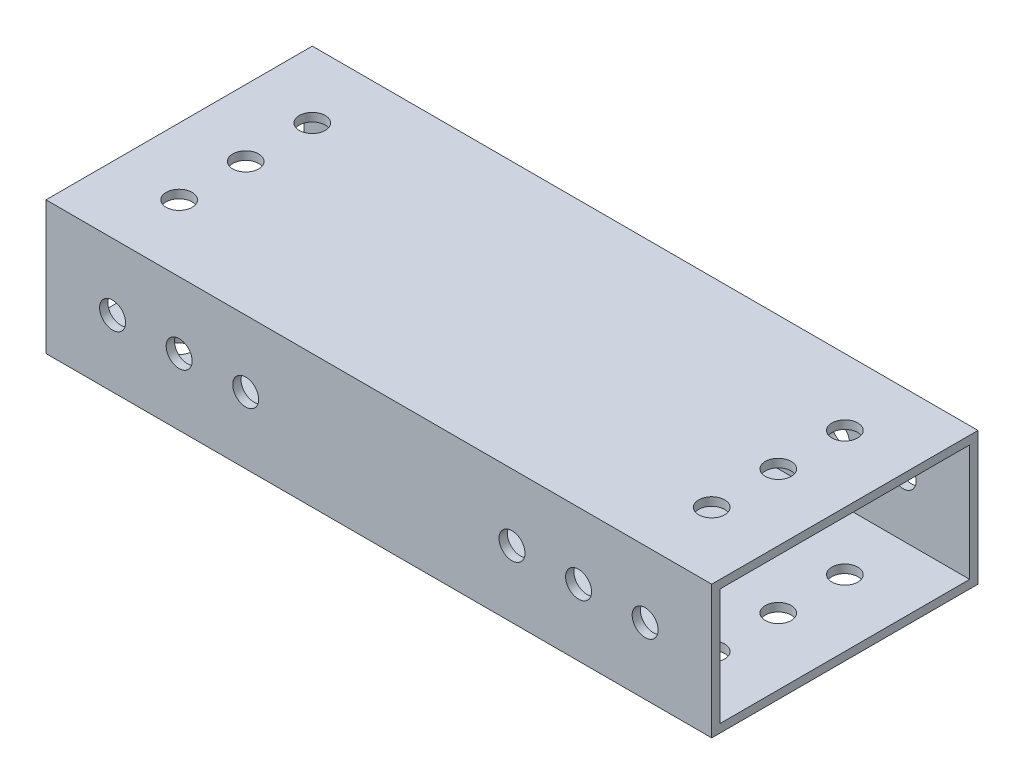
ISO-10303-21;
HEADER;
FILE_DESCRIPTION(('STEP AP214'),'2;1');
FILE_NAME('part.step','',(''),(''),'','','');
FILE_SCHEMA(('AUTOMOTIVE_DESIGN { 1 0 10303 214 1 1 1 1 }'));
ENDSEC;
DATA;
#1=APPLICATION_CONTEXT('core data for automotive mechanical design processes');
#2=APPLICATION_PROTOCOL_DEFINITION('international standard','automotive_design',2000,#1);
#3=PRODUCT_CONTEXT('',#1,'mechanical');
#4=PRODUCT('Part','Part','',(#3));
#5=PRODUCT_RELATED_PRODUCT_CATEGORY('part','',(#4));
#6=PRODUCT_DEFINITION_FORMATION('','',#4);
#7=PRODUCT_DEFINITION_CONTEXT('part definition',#1,'design');
#8=PRODUCT_DEFINITION('design','',#6,#7);
#9=PRODUCT_DEFINITION_SHAPE('','',#8);
#10=(LENGTH_UNIT() NAMED_UNIT(*) SI_UNIT(.MILLI.,.METRE.));
#11=(NAMED_UNIT(*) PLANE_ANGLE_UNIT() SI_UNIT($,.RADIAN.));
#12=(NAMED_UNIT(*) SI_UNIT($,.STERADIAN.) SOLID_ANGLE_UNIT());
#13=UNCERTAINTY_MEASURE_WITH_UNIT(LENGTH_MEASURE(1.E-05),#10,'distance_accuracy_value','');
#14=(GEOMETRIC_REPRESENTATION_CONTEXT(3) GLOBAL_UNCERTAINTY_ASSIGNED_CONTEXT((#13)) GLOBAL_UNIT_ASSIGNED_CONTEXT((#10,
#11,#12)) REPRESENTATION_CONTEXT('',''));
#15=CARTESIAN_POINT('',(0.,0.,0.));
#16=DIRECTION('',(0.,0.,1.));
#17=DIRECTION('',(1.,0.,0.));
#18=AXIS2_PLACEMENT_3D('',#15,#16,#17);
#19=CARTESIAN_POINT('',(25.4,25.4,0.));
#20=DIRECTION('',(1.,0.,0.));
#21=DIRECTION('',(0.,0.,-1.));
#22=AXIS2_PLACEMENT_3D('',#19,#20,#21);
#23=PLANE('',#22);
#24=DIRECTION('',(0.,0.,1.));
#25=VECTOR('',#24,1.);
#26=CARTESIAN_POINT('',(25.4,0.,0.));
#27=LINE('',#26,#25);
#28=CARTESIAN_POINT('',(25.4,0.,-50.8));
#29=VERTEX_POINT('',#28);
#30=CARTESIAN_POINT('',(25.4,0.,0.));
#31=VERTEX_POINT('',#30);
#32=EDGE_CURVE('E133',#29,#31,#27,.T.);
#33=ORIENTED_EDGE('',*,*,#32,.T.);
#34=DIRECTION('',(0.,-1.,0.));
#35=VECTOR('',#34,1.);
#36=CARTESIAN_POINT('',(25.4,25.4,0.));
#37=LINE('',#36,#35);
#38=CARTESIAN_POINT('',(25.4,25.4,0.));
#39=VERTEX_POINT('',#38);
#40=EDGE_CURVE('E11',#39,#31,#37,.T.);
#41=ORIENTED_EDGE('',*,*,#40,.F.);
#42=DIRECTION('',(0.,0.,1.));
#43=VECTOR('',#42,1.);
#44=CARTESIAN_POINT('',(25.4,25.4,0.));
#45=LINE('',#44,#43);
#46=CARTESIAN_POINT('',(25.4,25.4,-50.8));
#47=VERTEX_POINT('',#46);
#48=EDGE_CURVE('E139',#47,#39,#45,.T.);
#49=ORIENTED_EDGE('',*,*,#48,.F.);
#50=DIRECTION('',(0.,-1.,0.));
#51=VECTOR('',#50,1.);
#52=CARTESIAN_POINT('',(25.4,25.4,-50.8));
#53=LINE('',#52,#51);
#54=EDGE_CURVE('E149',#47,#29,#53,.T.);
#55=ORIENTED_EDGE('',*,*,#54,.T.);
#56=EDGE_LOOP('',(#33,#41,#49,#55));
#57=FACE_BOUND('',#56,.T.);
#58=DIRECTION('',(0.,0.,1.));
#59=VECTOR('',#58,1.);
#60=CARTESIAN_POINT('',(25.4,1.5875,0.));
#61=LINE('',#60,#59);
#62=CARTESIAN_POINT('',(25.4,1.5875,-49.2125));
#63=VERTEX_POINT('',#62);
#64=CARTESIAN_POINT('',(25.4,1.5875,-1.5875));
#65=VERTEX_POINT('',#64);
#66=EDGE_CURVE('E109',#63,#65,#61,.T.);
#67=ORIENTED_EDGE('',*,*,#66,.F.);
#68=DIRECTION('',(0.,-1.,0.));
#69=VECTOR('',#68,1.);
#70=CARTESIAN_POINT('',(25.4,25.4,-49.2125));
#71=LINE('',#70,#69);
#72=CARTESIAN_POINT('',(25.4,23.8125,-49.2125));
#73=VERTEX_POINT('',#72);
#74=EDGE_CURVE('E129',#73,#63,#71,.T.);
#75=ORIENTED_EDGE('',*,*,#74,.F.);
#76=DIRECTION('',(0.,0.,1.));
#77=VECTOR('',#76,1.);
#78=CARTESIAN_POINT('',(25.4,23.8125,0.));
#79=LINE('',#78,#77);
#80=CARTESIAN_POINT('',(25.4,23.8125,-1.5875));
#81=VERTEX_POINT('',#80);
#82=EDGE_CURVE('E53',#73,#81,#79,.T.);
#83=ORIENTED_EDGE('',*,*,#82,.T.);
#84=DIRECTION('',(0.,-1.,0.));
#85=VECTOR('',#84,1.);
#86=CARTESIAN_POINT('',(25.4,25.4,-1.5875));
#87=LINE('',#86,#85);
#88=EDGE_CURVE('E119',#81,#65,#87,.T.);
#89=ORIENTED_EDGE('',*,*,#88,.T.);
#90=EDGE_LOOP('',(#67,#75,#83,#89));
#91=FACE_BOUND('',#90,.T.);
#92=ADVANCED_FACE('F37',(#57,#91),#23,.F.);
#93=CARTESIAN_POINT('',(152.4,25.4,0.));
#94=DIRECTION('',(-1.,0.,0.));
#95=DIRECTION('',(0.,0.,1.));
#96=AXIS2_PLACEMENT_3D('',#93,#94,#95);
#97=PLANE('',#96);
#98=DIRECTION('',(0.,0.,-1.));
#99=VECTOR('',#98,1.);
#100=CARTESIAN_POINT('',(152.4,0.,0.));
#101=LINE('',#100,#99);
#102=CARTESIAN_POINT('',(152.4,0.,0.));
#103=VERTEX_POINT('',#102);
#104=CARTESIAN_POINT('',(152.4,0.,-50.8));
#105=VERTEX_POINT('',#104);
#106=EDGE_CURVE('E154',#103,#105,#101,.T.);
#107=ORIENTED_EDGE('',*,*,#106,.T.);
#108=DIRECTION('',(0.,-1.,0.));
#109=VECTOR('',#108,1.);
#110=CARTESIAN_POINT('',(152.4,25.4,-50.8));
#111=LINE('',#110,#109);
#112=CARTESIAN_POINT('',(152.4,25.4,-50.8));
#113=VERTEX_POINT('',#112);
#114=EDGE_CURVE('E159',#113,#105,#111,.T.);
#115=ORIENTED_EDGE('',*,*,#114,.F.);
#116=DIRECTION('',(0.,0.,-1.));
#117=VECTOR('',#116,1.);
#118=CARTESIAN_POINT('',(152.4,25.4,0.));
#119=LINE('',#118,#117);
#120=CARTESIAN_POINT('',(152.4,25.4,0.));
#121=VERTEX_POINT('',#120);
#122=EDGE_CURVE('E145',#121,#113,#119,.T.);
#123=ORIENTED_EDGE('',*,*,#122,.F.);
#124=DIRECTION('',(0.,-1.,0.));
#125=VECTOR('',#124,1.);
#126=CARTESIAN_POINT('',(152.4,25.4,0.));
#127=LINE('',#126,#125);
#128=EDGE_CURVE('E45',#121,#103,#127,.T.);
#129=ORIENTED_EDGE('',*,*,#128,.T.);
#130=EDGE_LOOP('',(#107,#115,#123,#129));
#131=FACE_BOUND('',#130,.T.);
#132=DIRECTION('',(0.,0.,-1.));
#133=VECTOR('',#132,1.);
#134=CARTESIAN_POINT('',(152.4,1.5875,0.));
#135=LINE('',#134,#133);
#136=CARTESIAN_POINT('',(152.4,1.5875,-1.5875));
#137=VERTEX_POINT('',#136);
#138=CARTESIAN_POINT('',(152.4,1.5875,-49.2125));
#139=VERTEX_POINT('',#138);
#140=EDGE_CURVE('E106',#137,#139,#135,.T.);
#141=ORIENTED_EDGE('',*,*,#140,.F.);
#142=DIRECTION('',(0.,-1.,0.));
#143=VECTOR('',#142,1.);
#144=CARTESIAN_POINT('',(152.4,25.4,-1.5875));
#145=LINE('',#144,#143);
#146=CARTESIAN_POINT('',(152.4,23.8125,-1.5875));
#147=VERTEX_POINT('',#146);
#148=EDGE_CURVE('E115',#147,#137,#145,.T.);
#149=ORIENTED_EDGE('',*,*,#148,.F.);
#150=DIRECTION('',(0.,0.,-1.));
#151=VECTOR('',#150,1.);
#152=CARTESIAN_POINT('',(152.4,23.8125,0.));
#153=LINE('',#152,#151);
#154=CARTESIAN_POINT('',(152.4,23.8125,-49.2125));
#155=VERTEX_POINT('',#154);
#156=EDGE_CURVE('E58',#147,#155,#153,.T.);
#157=ORIENTED_EDGE('',*,*,#156,.T.);
#158=DIRECTION('',(0.,-1.,0.));
#159=VECTOR('',#158,1.);
#160=CARTESIAN_POINT('',(152.4,25.4,-49.2125));
#161=LINE('',#160,#159);
#162=EDGE_CURVE('E120',#155,#139,#161,.T.);
#163=ORIENTED_EDGE('',*,*,#162,.T.);
#164=EDGE_LOOP('',(#141,#149,#157,#163));
#165=FACE_BOUND('',#164,.T.);
#166=ADVANCED_FACE('F123',(#131,#165),#97,.F.);
#167=CARTESIAN_POINT('',(25.4,25.4,0.));
#168=DIRECTION('',(0.,0.,-1.));
#169=DIRECTION('',(-1.,0.,0.));
#170=AXIS2_PLACEMENT_3D('',#167,#168,#169);
#171=PLANE('',#170);
#172=CARTESIAN_POINT('',(139.7,12.7,0.));
#173=DIRECTION('',(0.,0.,1.));
#174=DIRECTION('',(1.,0.,0.));
#175=AXIS2_PLACEMENT_3D('',#172,#173,#174);
#176=CIRCLE('',#175,2.4765);
#177=CARTESIAN_POINT('',(142.1765,12.7,0.));
#178=VERTEX_POINT('',#177);
#179=EDGE_CURVE('E401',#178,#178,#176,.T.);
#180=ORIENTED_EDGE('',*,*,#179,.F.);
#181=EDGE_LOOP('',(#180));
#182=FACE_BOUND('',#181,.T.);
#183=CARTESIAN_POINT('',(127.,12.7,0.));
#184=DIRECTION('',(0.,0.,1.));
#185=DIRECTION('',(1.,0.,0.));
#186=AXIS2_PLACEMENT_3D('',#183,#184,#185);
#187=CIRCLE('',#186,2.4765);
#188=CARTESIAN_POINT('',(129.4765,12.7,0.));
#189=VERTEX_POINT('',#188);
#190=EDGE_CURVE('E402',#189,#189,#187,.T.);
#191=ORIENTED_EDGE('',*,*,#190,.F.);
#192=EDGE_LOOP('',(#191));
#193=FACE_BOUND('',#192,.T.);
#194=CARTESIAN_POINT('',(114.3,12.7,0.));
#195=DIRECTION('',(0.,0.,1.));
#196=DIRECTION('',(1.,0.,0.));
#197=AXIS2_PLACEMENT_3D('',#194,#195,#196);
#198=CIRCLE('',#197,2.4765);
#199=CARTESIAN_POINT('',(116.7765,12.7,0.));
#200=VERTEX_POINT('',#199);
#201=EDGE_CURVE('E411',#200,#200,#198,.T.);
#202=ORIENTED_EDGE('',*,*,#201,.F.);
#203=EDGE_LOOP('',(#202));
#204=FACE_BOUND('',#203,.T.);
#205=CARTESIAN_POINT('',(63.5,12.7,0.));
#206=DIRECTION('',(0.,0.,1.));
#207=DIRECTION('',(1.,0.,0.));
#208=AXIS2_PLACEMENT_3D('',#205,#206,#207);
#209=CIRCLE('',#208,2.4765);
#210=CARTESIAN_POINT('',(65.9765,12.7,0.));
#211=VERTEX_POINT('',#210);
#212=EDGE_CURVE('E416',#211,#211,#209,.T.);
#213=ORIENTED_EDGE('',*,*,#212,.F.);
#214=EDGE_LOOP('',(#213));
#215=FACE_BOUND('',#214,.T.);
#216=CARTESIAN_POINT('',(50.8,12.7,0.));
#217=DIRECTION('',(0.,0.,1.));
#218=DIRECTION('',(1.,0.,0.));
#219=AXIS2_PLACEMENT_3D('',#216,#217,#218);
#220=CIRCLE('',#219,2.4765);
#221=CARTESIAN_POINT('',(53.2765,12.7,0.));
#222=VERTEX_POINT('',#221);
#223=EDGE_CURVE('E422',#222,#222,#220,.T.);
#224=ORIENTED_EDGE('',*,*,#223,.F.);
#225=EDGE_LOOP('',(#224));
#226=FACE_BOUND('',#225,.T.);
#227=CARTESIAN_POINT('',(38.1,12.7,0.));
#228=DIRECTION('',(0.,0.,1.));
#229=DIRECTION('',(1.,0.,0.));
#230=AXIS2_PLACEMENT_3D('',#227,#228,#229);
#231=CIRCLE('',#230,2.4765);
#232=CARTESIAN_POINT('',(40.5765,12.7,0.));
#233=VERTEX_POINT('',#232);
#234=EDGE_CURVE('E428',#233,#233,#231,.T.);
#235=ORIENTED_EDGE('',*,*,#234,.F.);
#236=EDGE_LOOP('',(#235));
#237=FACE_BOUND('',#236,.T.);
#238=DIRECTION('',(1.,0.,0.));
#239=VECTOR('',#238,1.);
#240=CARTESIAN_POINT('',(25.4,0.,0.));
#241=LINE('',#240,#239);
#242=EDGE_CURVE('E152',#31,#103,#241,.T.);
#243=ORIENTED_EDGE('',*,*,#242,.T.);
#244=ORIENTED_EDGE('',*,*,#128,.F.);
#245=DIRECTION('',(1.,0.,0.));
#246=VECTOR('',#245,1.);
#247=CARTESIAN_POINT('',(25.4,25.4,0.));
#248=LINE('',#247,#246);
#249=EDGE_CURVE('E142',#39,#121,#248,.T.);
#250=ORIENTED_EDGE('',*,*,#249,.F.);
#251=ORIENTED_EDGE('',*,*,#40,.T.);
#252=EDGE_LOOP('',(#243,#244,#250,#251));
#253=FACE_BOUND('',#252,.T.);
#254=ADVANCED_FACE('F278',(#182,#193,#204,#215,#226,#237,#253),#171,.F.);
#255=CARTESIAN_POINT('',(25.4,25.4,-50.8));
#256=DIRECTION('',(0.,0.,1.));
#257=DIRECTION('',(1.,0.,0.));
#258=AXIS2_PLACEMENT_3D('',#255,#256,#257);
#259=PLANE('',#258);
#260=CARTESIAN_POINT('',(139.7,12.7,-50.8));
#261=DIRECTION('',(0.,0.,1.));
#262=DIRECTION('',(1.,0.,0.));
#263=AXIS2_PLACEMENT_3D('',#260,#261,#262);
#264=CIRCLE('',#263,2.4765);
#265=CARTESIAN_POINT('',(142.1765,12.7,-50.8));
#266=VERTEX_POINT('',#265);
#267=EDGE_CURVE('E192',#266,#266,#264,.F.);
#268=ORIENTED_EDGE('',*,*,#267,.F.);
#269=EDGE_LOOP('',(#268));
#270=FACE_BOUND('',#269,.T.);
#271=CARTESIAN_POINT('',(127.,12.7,-50.8));
#272=DIRECTION('',(0.,0.,1.));
#273=DIRECTION('',(1.,0.,0.));
#274=AXIS2_PLACEMENT_3D('',#271,#272,#273);
#275=CIRCLE('',#274,2.4765);
#276=CARTESIAN_POINT('',(129.4765,12.7,-50.8));
#277=VERTEX_POINT('',#276);
#278=EDGE_CURVE('E407',#277,#277,#275,.F.);
#279=ORIENTED_EDGE('',*,*,#278,.F.);
#280=EDGE_LOOP('',(#279));
#281=FACE_BOUND('',#280,.T.);
#282=CARTESIAN_POINT('',(114.3,12.7,-50.8));
#283=DIRECTION('',(0.,0.,1.));
#284=DIRECTION('',(1.,0.,0.));
#285=AXIS2_PLACEMENT_3D('',#282,#283,#284);
#286=CIRCLE('',#285,2.4765);
#287=CARTESIAN_POINT('',(116.7765,12.7,-50.8));
#288=VERTEX_POINT('',#287);
#289=EDGE_CURVE('E413',#288,#288,#286,.F.);
#290=ORIENTED_EDGE('',*,*,#289,.F.);
#291=EDGE_LOOP('',(#290));
#292=FACE_BOUND('',#291,.T.);
#293=CARTESIAN_POINT('',(63.5,12.7,-50.8));
#294=DIRECTION('',(0.,0.,1.));
#295=DIRECTION('',(1.,0.,0.));
#296=AXIS2_PLACEMENT_3D('',#293,#294,#295);
#297=CIRCLE('',#296,2.4765);
#298=CARTESIAN_POINT('',(65.9765,12.7,-50.8));
#299=VERTEX_POINT('',#298);
#300=EDGE_CURVE('E419',#299,#299,#297,.F.);
#301=ORIENTED_EDGE('',*,*,#300,.F.);
#302=EDGE_LOOP('',(#301));
#303=FACE_BOUND('',#302,.T.);
#304=CARTESIAN_POINT('',(50.8,12.7,-50.8));
#305=DIRECTION('',(0.,0.,1.));
#306=DIRECTION('',(1.,0.,0.));
#307=AXIS2_PLACEMENT_3D('',#304,#305,#306);
#308=CIRCLE('',#307,2.4765);
#309=CARTESIAN_POINT('',(53.2765,12.7,-50.8));
#310=VERTEX_POINT('',#309);
#311=EDGE_CURVE('E425',#310,#310,#308,.F.);
#312=ORIENTED_EDGE('',*,*,#311,.F.);
#313=EDGE_LOOP('',(#312));
#314=FACE_BOUND('',#313,.T.);
#315=CARTESIAN_POINT('',(38.1,12.7,-50.8));
#316=DIRECTION('',(0.,0.,1.));
#317=DIRECTION('',(1.,0.,0.));
#318=AXIS2_PLACEMENT_3D('',#315,#316,#317);
#319=CIRCLE('',#318,2.4765);
#320=CARTESIAN_POINT('',(40.5765,12.7,-50.8));
#321=VERTEX_POINT('',#320);
#322=EDGE_CURVE('E431',#321,#321,#319,.F.);
#323=ORIENTED_EDGE('',*,*,#322,.F.);
#324=EDGE_LOOP('',(#323));
#325=FACE_BOUND('',#324,.T.);
#326=DIRECTION('',(-1.,0.,0.));
#327=VECTOR('',#326,1.);
#328=CARTESIAN_POINT('',(25.4,0.,-50.8));
#329=LINE('',#328,#327);
#330=EDGE_CURVE('E143',#105,#29,#329,.T.);
#331=ORIENTED_EDGE('',*,*,#330,.T.);
#332=ORIENTED_EDGE('',*,*,#54,.F.);
#333=DIRECTION('',(-1.,0.,0.));
#334=VECTOR('',#333,1.);
#335=CARTESIAN_POINT('',(25.4,25.4,-50.8));
#336=LINE('',#335,#334);
#337=EDGE_CURVE('E147',#113,#47,#336,.T.);
#338=ORIENTED_EDGE('',*,*,#337,.F.);
#339=ORIENTED_EDGE('',*,*,#114,.T.);
#340=EDGE_LOOP('',(#331,#332,#338,#339));
#341=FACE_BOUND('',#340,.T.);
#342=ADVANCED_FACE('F297',(#270,#281,#292,#303,#314,#325,#341),#259,.F.);
#343=CARTESIAN_POINT('',(0.,25.4,0.));
#344=DIRECTION('',(0.,-1.,0.));
#345=DIRECTION('',(0.,0.,-1.));
#346=AXIS2_PLACEMENT_3D('',#343,#344,#345);
#347=PLANE('',#346);
#348=CARTESIAN_POINT('',(139.7,25.4,-12.7));
#349=DIRECTION('',(0.,-1.,0.));
#350=DIRECTION('',(0.,0.,-1.));
#351=AXIS2_PLACEMENT_3D('',#348,#349,#350);
#352=CIRCLE('',#351,2.4765);
#353=CARTESIAN_POINT('',(139.7,25.4,-15.1765));
#354=VERTEX_POINT('',#353);
#355=EDGE_CURVE('E221',#354,#354,#352,.F.);
#356=ORIENTED_EDGE('',*,*,#355,.F.);
#357=EDGE_LOOP('',(#356));
#358=FACE_BOUND('',#357,.T.);
#359=CARTESIAN_POINT('',(139.7,25.4,-25.4));
#360=DIRECTION('',(0.,-1.,0.));
#361=DIRECTION('',(0.,0.,-1.));
#362=AXIS2_PLACEMENT_3D('',#359,#360,#361);
#363=CIRCLE('',#362,2.4765);
#364=CARTESIAN_POINT('',(139.7,25.4,-27.8765));
#365=VERTEX_POINT('',#364);
#366=EDGE_CURVE('E242',#365,#365,#363,.F.);
#367=ORIENTED_EDGE('',*,*,#366,.F.);
#368=EDGE_LOOP('',(#367));
#369=FACE_BOUND('',#368,.T.);
#370=CARTESIAN_POINT('',(139.7,25.4,-38.1));
#371=DIRECTION('',(0.,-1.,0.));
#372=DIRECTION('',(0.,0.,-1.));
#373=AXIS2_PLACEMENT_3D('',#370,#371,#372);
#374=CIRCLE('',#373,2.4765);
#375=CARTESIAN_POINT('',(139.7,25.4,-40.5765));
#376=VERTEX_POINT('',#375);
#377=EDGE_CURVE('E236',#376,#376,#374,.F.);
#378=ORIENTED_EDGE('',*,*,#377,.F.);
#379=EDGE_LOOP('',(#378));
#380=FACE_BOUND('',#379,.T.);
#381=CARTESIAN_POINT('',(38.1,25.4,-38.1));
#382=DIRECTION('',(0.,-1.,0.));
#383=DIRECTION('',(0.,0.,-1.));
#384=AXIS2_PLACEMENT_3D('',#381,#382,#383);
#385=CIRCLE('',#384,2.47650000000001);
#386=CARTESIAN_POINT('',(38.1,25.4,-40.5765));
#387=VERTEX_POINT('',#386);
#388=EDGE_CURVE('E230',#387,#387,#385,.F.);
#389=ORIENTED_EDGE('',*,*,#388,.F.);
#390=EDGE_LOOP('',(#389));
#391=FACE_BOUND('',#390,.T.);
#392=CARTESIAN_POINT('',(38.1,25.4,-25.4));
#393=DIRECTION('',(0.,-1.,0.));
#394=DIRECTION('',(0.,0.,-1.));
#395=AXIS2_PLACEMENT_3D('',#392,#393,#394);
#396=CIRCLE('',#395,2.4765);
#397=CARTESIAN_POINT('',(38.1,25.4,-27.8765));
#398=VERTEX_POINT('',#397);
#399=EDGE_CURVE('E222',#398,#398,#396,.F.);
#400=ORIENTED_EDGE('',*,*,#399,.F.);
#401=EDGE_LOOP('',(#400));
#402=FACE_BOUND('',#401,.T.);
#403=CARTESIAN_POINT('',(38.1,25.4,-12.7));
#404=DIRECTION('',(0.,-1.,0.));
#405=DIRECTION('',(0.,0.,-1.));
#406=AXIS2_PLACEMENT_3D('',#403,#404,#405);
#407=CIRCLE('',#406,2.4765);
#408=CARTESIAN_POINT('',(38.1,25.4,-15.1765));
#409=VERTEX_POINT('',#408);
#410=EDGE_CURVE('E168',#409,#409,#407,.F.);
#411=ORIENTED_EDGE('',*,*,#410,.F.);
#412=EDGE_LOOP('',(#411));
#413=FACE_BOUND('',#412,.T.);
#414=ORIENTED_EDGE('',*,*,#48,.T.);
#415=ORIENTED_EDGE('',*,*,#249,.T.);
#416=ORIENTED_EDGE('',*,*,#122,.T.);
#417=ORIENTED_EDGE('',*,*,#337,.T.);
#418=EDGE_LOOP('',(#414,#415,#416,#417));
#419=FACE_BOUND('',#418,.T.);
#420=ADVANCED_FACE('F293',(#358,#369,#380,#391,#402,#413,#419),#347,.F.);
#421=CARTESIAN_POINT('',(0.,0.,0.));
#422=DIRECTION('',(0.,-1.,0.));
#423=DIRECTION('',(0.,0.,-1.));
#424=AXIS2_PLACEMENT_3D('',#421,#422,#423);
#425=PLANE('',#424);
#426=CARTESIAN_POINT('',(139.7,0.,-12.7));
#427=DIRECTION('',(0.,-1.,0.));
#428=DIRECTION('',(0.,0.,-1.));
#429=AXIS2_PLACEMENT_3D('',#426,#427,#428);
#430=CIRCLE('',#429,2.4765);
#431=CARTESIAN_POINT('',(139.7,0.,-15.1765));
#432=VERTEX_POINT('',#431);
#433=EDGE_CURVE('E245',#432,#432,#430,.T.);
#434=ORIENTED_EDGE('',*,*,#433,.F.);
#435=EDGE_LOOP('',(#434));
#436=FACE_BOUND('',#435,.T.);
#437=CARTESIAN_POINT('',(139.7,0.,-25.4));
#438=DIRECTION('',(0.,-1.,0.));
#439=DIRECTION('',(0.,0.,-1.));
#440=AXIS2_PLACEMENT_3D('',#437,#438,#439);
#441=CIRCLE('',#440,2.4765);
#442=CARTESIAN_POINT('',(139.7,0.,-27.8765));
#443=VERTEX_POINT('',#442);
#444=EDGE_CURVE('E239',#443,#443,#441,.T.);
#445=ORIENTED_EDGE('',*,*,#444,.F.);
#446=EDGE_LOOP('',(#445));
#447=FACE_BOUND('',#446,.T.);
#448=CARTESIAN_POINT('',(139.7,0.,-38.1));
#449=DIRECTION('',(0.,-1.,0.));
#450=DIRECTION('',(0.,0.,-1.));
#451=AXIS2_PLACEMENT_3D('',#448,#449,#450);
#452=CIRCLE('',#451,2.4765);
#453=CARTESIAN_POINT('',(139.7,0.,-40.5765));
#454=VERTEX_POINT('',#453);
#455=EDGE_CURVE('E233',#454,#454,#452,.T.);
#456=ORIENTED_EDGE('',*,*,#455,.F.);
#457=EDGE_LOOP('',(#456));
#458=FACE_BOUND('',#457,.T.);
#459=CARTESIAN_POINT('',(38.1,0.,-38.1));
#460=DIRECTION('',(0.,-1.,0.));
#461=DIRECTION('',(0.,0.,-1.));
#462=AXIS2_PLACEMENT_3D('',#459,#460,#461);
#463=CIRCLE('',#462,2.47650000000001);
#464=CARTESIAN_POINT('',(38.1,0.,-40.5765));
#465=VERTEX_POINT('',#464);
#466=EDGE_CURVE('E226',#465,#465,#463,.T.);
#467=ORIENTED_EDGE('',*,*,#466,.F.);
#468=EDGE_LOOP('',(#467));
#469=FACE_BOUND('',#468,.T.);
#470=CARTESIAN_POINT('',(38.1,0.,-25.4));
#471=DIRECTION('',(0.,-1.,0.));
#472=DIRECTION('',(0.,0.,-1.));
#473=AXIS2_PLACEMENT_3D('',#470,#471,#472);
#474=CIRCLE('',#473,2.4765);
#475=CARTESIAN_POINT('',(38.1,0.,-27.8765));
#476=VERTEX_POINT('',#475);
#477=EDGE_CURVE('E225',#476,#476,#474,.T.);
#478=ORIENTED_EDGE('',*,*,#477,.F.);
#479=EDGE_LOOP('',(#478));
#480=FACE_BOUND('',#479,.T.);
#481=CARTESIAN_POINT('',(38.1,0.,-12.7));
#482=DIRECTION('',(0.,-1.,0.));
#483=DIRECTION('',(0.,0.,-1.));
#484=AXIS2_PLACEMENT_3D('',#481,#482,#483);
#485=CIRCLE('',#484,2.4765);
#486=CARTESIAN_POINT('',(38.1,0.,-15.1765));
#487=VERTEX_POINT('',#486);
#488=EDGE_CURVE('E229',#487,#487,#485,.T.);
#489=ORIENTED_EDGE('',*,*,#488,.F.);
#490=EDGE_LOOP('',(#489));
#491=FACE_BOUND('',#490,.T.);
#492=ORIENTED_EDGE('',*,*,#32,.F.);
#493=ORIENTED_EDGE('',*,*,#330,.F.);
#494=ORIENTED_EDGE('',*,*,#106,.F.);
#495=ORIENTED_EDGE('',*,*,#242,.F.);
#496=EDGE_LOOP('',(#492,#493,#494,#495));
#497=FACE_BOUND('',#496,.T.);
#498=ADVANCED_FACE('F287',(#436,#447,#458,#469,#480,#491,#497),#425,.T.);
#499=CARTESIAN_POINT('',(25.4,25.4,-1.5875));
#500=DIRECTION('',(0.,0.,-1.));
#501=DIRECTION('',(-1.,0.,0.));
#502=AXIS2_PLACEMENT_3D('',#499,#500,#501);
#503=PLANE('',#502);
#504=CARTESIAN_POINT('',(139.7,12.7,-1.5875));
#505=DIRECTION('',(0.,0.,-1.));
#506=DIRECTION('',(-1.,0.,0.));
#507=AXIS2_PLACEMENT_3D('',#504,#505,#506);
#508=CIRCLE('',#507,2.4765);
#509=CARTESIAN_POINT('',(137.2235,12.7,-1.5875));
#510=VERTEX_POINT('',#509);
#511=EDGE_CURVE('E218',#510,#510,#508,.T.);
#512=ORIENTED_EDGE('',*,*,#511,.F.);
#513=EDGE_LOOP('',(#512));
#514=FACE_BOUND('',#513,.T.);
#515=CARTESIAN_POINT('',(127.,12.7,-1.5875));
#516=DIRECTION('',(0.,0.,-1.));
#517=DIRECTION('',(-1.,0.,0.));
#518=AXIS2_PLACEMENT_3D('',#515,#516,#517);
#519=CIRCLE('',#518,2.4765);
#520=CARTESIAN_POINT('',(124.5235,12.7,-1.5875));
#521=VERTEX_POINT('',#520);
#522=EDGE_CURVE('E206',#521,#521,#519,.T.);
#523=ORIENTED_EDGE('',*,*,#522,.F.);
#524=EDGE_LOOP('',(#523));
#525=FACE_BOUND('',#524,.T.);
#526=CARTESIAN_POINT('',(114.3,12.7,-1.5875));
#527=DIRECTION('',(0.,0.,-1.));
#528=DIRECTION('',(-1.,0.,0.));
#529=AXIS2_PLACEMENT_3D('',#526,#527,#528);
#530=CIRCLE('',#529,2.4765);
#531=CARTESIAN_POINT('',(111.8235,12.7,-1.5875));
#532=VERTEX_POINT('',#531);
#533=EDGE_CURVE('E203',#532,#532,#530,.T.);
#534=ORIENTED_EDGE('',*,*,#533,.F.);
#535=EDGE_LOOP('',(#534));
#536=FACE_BOUND('',#535,.T.);
#537=CARTESIAN_POINT('',(63.5,12.7,-1.5875));
#538=DIRECTION('',(0.,0.,-1.));
#539=DIRECTION('',(-1.,0.,0.));
#540=AXIS2_PLACEMENT_3D('',#537,#538,#539);
#541=CIRCLE('',#540,2.4765);
#542=CARTESIAN_POINT('',(61.0235,12.7,-1.5875));
#543=VERTEX_POINT('',#542);
#544=EDGE_CURVE('E200',#543,#543,#541,.T.);
#545=ORIENTED_EDGE('',*,*,#544,.F.);
#546=EDGE_LOOP('',(#545));
#547=FACE_BOUND('',#546,.T.);
#548=CARTESIAN_POINT('',(50.8,12.7,-1.5875));
#549=DIRECTION('',(0.,0.,-1.));
#550=DIRECTION('',(-1.,0.,0.));
#551=AXIS2_PLACEMENT_3D('',#548,#549,#550);
#552=CIRCLE('',#551,2.4765);
#553=CARTESIAN_POINT('',(48.3235,12.7,-1.5875));
#554=VERTEX_POINT('',#553);
#555=EDGE_CURVE('E196',#554,#554,#552,.T.);
#556=ORIENTED_EDGE('',*,*,#555,.F.);
#557=EDGE_LOOP('',(#556));
#558=FACE_BOUND('',#557,.T.);
#559=CARTESIAN_POINT('',(38.1,12.7,-1.5875));
#560=DIRECTION('',(0.,0.,-1.));
#561=DIRECTION('',(-1.,0.,0.));
#562=AXIS2_PLACEMENT_3D('',#559,#560,#561);
#563=CIRCLE('',#562,2.4765);
#564=CARTESIAN_POINT('',(35.6235,12.7,-1.5875));
#565=VERTEX_POINT('',#564);
#566=EDGE_CURVE('E191',#565,#565,#563,.T.);
#567=ORIENTED_EDGE('',*,*,#566,.F.);
#568=EDGE_LOOP('',(#567));
#569=FACE_BOUND('',#568,.T.);
#570=DIRECTION('',(1.,0.,0.));
#571=VECTOR('',#570,1.);
#572=CARTESIAN_POINT('',(0.,1.5875,-1.5875));
#573=LINE('',#572,#571);
#574=EDGE_CURVE('E102',#65,#137,#573,.T.);
#575=ORIENTED_EDGE('',*,*,#574,.F.);
#576=ORIENTED_EDGE('',*,*,#88,.F.);
#577=DIRECTION('',(1.,0.,0.));
#578=VECTOR('',#577,1.);
#579=CARTESIAN_POINT('',(0.,23.8125,-1.5875));
#580=LINE('',#579,#578);
#581=EDGE_CURVE('E117',#81,#147,#580,.T.);
#582=ORIENTED_EDGE('',*,*,#581,.T.);
#583=ORIENTED_EDGE('',*,*,#148,.T.);
#584=EDGE_LOOP('',(#575,#576,#582,#583));
#585=FACE_BOUND('',#584,.T.);
#586=ADVANCED_FACE('F116',(#514,#525,#536,#547,#558,#569,#585),#503,.T.);
#587=CARTESIAN_POINT('',(25.4,25.4,-49.2125));
#588=DIRECTION('',(0.,0.,1.));
#589=DIRECTION('',(1.,0.,0.));
#590=AXIS2_PLACEMENT_3D('',#587,#588,#589);
#591=PLANE('',#590);
#592=CARTESIAN_POINT('',(139.7,12.7,-49.2125));
#593=DIRECTION('',(0.,0.,1.));
#594=DIRECTION('',(1.,0.,0.));
#595=AXIS2_PLACEMENT_3D('',#592,#593,#594);
#596=CIRCLE('',#595,2.4765);
#597=CARTESIAN_POINT('',(142.1765,12.7,-49.2125));
#598=VERTEX_POINT('',#597);
#599=EDGE_CURVE('E40',#598,#598,#596,.T.);
#600=ORIENTED_EDGE('',*,*,#599,.F.);
#601=EDGE_LOOP('',(#600));
#602=FACE_BOUND('',#601,.T.);
#603=CARTESIAN_POINT('',(127.,12.7,-49.2125));
#604=DIRECTION('',(0.,0.,1.));
#605=DIRECTION('',(1.,0.,0.));
#606=AXIS2_PLACEMENT_3D('',#603,#604,#605);
#607=CIRCLE('',#606,2.4765);
#608=CARTESIAN_POINT('',(129.4765,12.7,-49.2125));
#609=VERTEX_POINT('',#608);
#610=EDGE_CURVE('E204',#609,#609,#607,.T.);
#611=ORIENTED_EDGE('',*,*,#610,.F.);
#612=EDGE_LOOP('',(#611));
#613=FACE_BOUND('',#612,.T.);
#614=CARTESIAN_POINT('',(114.3,12.7,-49.2125));
#615=DIRECTION('',(0.,0.,1.));
#616=DIRECTION('',(1.,0.,0.));
#617=AXIS2_PLACEMENT_3D('',#614,#615,#616);
#618=CIRCLE('',#617,2.4765);
#619=CARTESIAN_POINT('',(116.7765,12.7,-49.2125));
#620=VERTEX_POINT('',#619);
#621=EDGE_CURVE('E201',#620,#620,#618,.T.);
#622=ORIENTED_EDGE('',*,*,#621,.F.);
#623=EDGE_LOOP('',(#622));
#624=FACE_BOUND('',#623,.T.);
#625=CARTESIAN_POINT('',(63.5,12.7,-49.2125));
#626=DIRECTION('',(0.,0.,1.));
#627=DIRECTION('',(1.,0.,0.));
#628=AXIS2_PLACEMENT_3D('',#625,#626,#627);
#629=CIRCLE('',#628,2.4765);
#630=CARTESIAN_POINT('',(65.9765,12.7,-49.2125));
#631=VERTEX_POINT('',#630);
#632=EDGE_CURVE('E197',#631,#631,#629,.T.);
#633=ORIENTED_EDGE('',*,*,#632,.F.);
#634=EDGE_LOOP('',(#633));
#635=FACE_BOUND('',#634,.T.);
#636=CARTESIAN_POINT('',(50.8,12.7,-49.2125));
#637=DIRECTION('',(0.,0.,1.));
#638=DIRECTION('',(1.,0.,0.));
#639=AXIS2_PLACEMENT_3D('',#636,#637,#638);
#640=CIRCLE('',#639,2.4765);
#641=CARTESIAN_POINT('',(53.2765,12.7,-49.2125));
#642=VERTEX_POINT('',#641);
#643=EDGE_CURVE('E193',#642,#642,#640,.T.);
#644=ORIENTED_EDGE('',*,*,#643,.F.);
#645=EDGE_LOOP('',(#644));
#646=FACE_BOUND('',#645,.T.);
#647=CARTESIAN_POINT('',(38.1,12.7,-49.2125));
#648=DIRECTION('',(0.,0.,1.));
#649=DIRECTION('',(1.,0.,0.));
#650=AXIS2_PLACEMENT_3D('',#647,#648,#649);
#651=CIRCLE('',#650,2.4765);
#652=CARTESIAN_POINT('',(40.5765,12.7,-49.2125));
#653=VERTEX_POINT('',#652);
#654=EDGE_CURVE('E188',#653,#653,#651,.T.);
#655=ORIENTED_EDGE('',*,*,#654,.F.);
#656=EDGE_LOOP('',(#655));
#657=FACE_BOUND('',#656,.T.);
#658=DIRECTION('',(-1.,0.,0.));
#659=VECTOR('',#658,1.);
#660=CARTESIAN_POINT('',(0.,1.5875,-49.2125));
#661=LINE('',#660,#659);
#662=EDGE_CURVE('E124',#139,#63,#661,.T.);
#663=ORIENTED_EDGE('',*,*,#662,.F.);
#664=ORIENTED_EDGE('',*,*,#162,.F.);
#665=DIRECTION('',(-1.,0.,0.));
#666=VECTOR('',#665,1.);
#667=CARTESIAN_POINT('',(0.,23.8125,-49.2125));
#668=LINE('',#667,#666);
#669=EDGE_CURVE('E131',#155,#73,#668,.T.);
#670=ORIENTED_EDGE('',*,*,#669,.T.);
#671=ORIENTED_EDGE('',*,*,#74,.T.);
#672=EDGE_LOOP('',(#663,#664,#670,#671));
#673=FACE_BOUND('',#672,.T.);
#674=ADVANCED_FACE('F271',(#602,#613,#624,#635,#646,#657,#673),#591,.T.);
#675=CARTESIAN_POINT('',(0.,23.8125,0.));
#676=DIRECTION('',(0.,-1.,0.));
#677=DIRECTION('',(0.,0.,-1.));
#678=AXIS2_PLACEMENT_3D('',#675,#676,#677);
#679=PLANE('',#678);
#680=CARTESIAN_POINT('',(139.7,23.8125,-12.7));
#681=DIRECTION('',(0.,-1.,0.));
#682=DIRECTION('',(0.,0.,-1.));
#683=AXIS2_PLACEMENT_3D('',#680,#681,#682);
#684=CIRCLE('',#683,2.4765);
#685=CARTESIAN_POINT('',(139.7,23.8125,-15.1765));
#686=VERTEX_POINT('',#685);
#687=EDGE_CURVE('E138',#686,#686,#684,.T.);
#688=ORIENTED_EDGE('',*,*,#687,.F.);
#689=EDGE_LOOP('',(#688));
#690=FACE_BOUND('',#689,.T.);
#691=CARTESIAN_POINT('',(139.7,23.8125,-25.4));
#692=DIRECTION('',(0.,-1.,0.));
#693=DIRECTION('',(0.,0.,-1.));
#694=AXIS2_PLACEMENT_3D('',#691,#692,#693);
#695=CIRCLE('',#694,2.4765);
#696=CARTESIAN_POINT('',(139.7,23.8125,-27.8765));
#697=VERTEX_POINT('',#696);
#698=EDGE_CURVE('E184',#697,#697,#695,.T.);
#699=ORIENTED_EDGE('',*,*,#698,.F.);
#700=EDGE_LOOP('',(#699));
#701=FACE_BOUND('',#700,.T.);
#702=CARTESIAN_POINT('',(139.7,23.8125,-38.1));
#703=DIRECTION('',(0.,-1.,0.));
#704=DIRECTION('',(0.,0.,-1.));
#705=AXIS2_PLACEMENT_3D('',#702,#703,#704);
#706=CIRCLE('',#705,2.4765);
#707=CARTESIAN_POINT('',(139.7,23.8125,-40.5765));
#708=VERTEX_POINT('',#707);
#709=EDGE_CURVE('E180',#708,#708,#706,.T.);
#710=ORIENTED_EDGE('',*,*,#709,.F.);
#711=EDGE_LOOP('',(#710));
#712=FACE_BOUND('',#711,.T.);
#713=CARTESIAN_POINT('',(38.1,23.8125,-38.1));
#714=DIRECTION('',(0.,-1.,0.));
#715=DIRECTION('',(0.,0.,-1.));
#716=AXIS2_PLACEMENT_3D('',#713,#714,#715);
#717=CIRCLE('',#716,2.47650000000001);
#718=CARTESIAN_POINT('',(38.1,23.8125,-40.5765));
#719=VERTEX_POINT('',#718);
#720=EDGE_CURVE('E176',#719,#719,#717,.T.);
#721=ORIENTED_EDGE('',*,*,#720,.F.);
#722=EDGE_LOOP('',(#721));
#723=FACE_BOUND('',#722,.T.);
#724=CARTESIAN_POINT('',(38.1,23.8125,-25.4));
#725=DIRECTION('',(0.,-1.,0.));
#726=DIRECTION('',(0.,0.,-1.));
#727=AXIS2_PLACEMENT_3D('',#724,#725,#726);
#728=CIRCLE('',#727,2.4765);
#729=CARTESIAN_POINT('',(38.1,23.8125,-27.8765));
#730=VERTEX_POINT('',#729);
#731=EDGE_CURVE('E172',#730,#730,#728,.T.);
#732=ORIENTED_EDGE('',*,*,#731,.F.);
#733=EDGE_LOOP('',(#732));
#734=FACE_BOUND('',#733,.T.);
#735=CARTESIAN_POINT('',(38.1,23.8125,-12.7));
#736=DIRECTION('',(0.,-1.,0.));
#737=DIRECTION('',(0.,0.,-1.));
#738=AXIS2_PLACEMENT_3D('',#735,#736,#737);
#739=CIRCLE('',#738,2.4765);
#740=CARTESIAN_POINT('',(38.1,23.8125,-15.1765));
#741=VERTEX_POINT('',#740);
#742=EDGE_CURVE('E167',#741,#741,#739,.T.);
#743=ORIENTED_EDGE('',*,*,#742,.F.);
#744=EDGE_LOOP('',(#743));
#745=FACE_BOUND('',#744,.T.);
#746=ORIENTED_EDGE('',*,*,#82,.F.);
#747=ORIENTED_EDGE('',*,*,#669,.F.);
#748=ORIENTED_EDGE('',*,*,#156,.F.);
#749=ORIENTED_EDGE('',*,*,#581,.F.);
#750=EDGE_LOOP('',(#746,#747,#748,#749));
#751=FACE_BOUND('',#750,.T.);
#752=ADVANCED_FACE('F317',(#690,#701,#712,#723,#734,#745,#751),#679,.T.);
#753=CARTESIAN_POINT('',(0.,1.5875,0.));
#754=DIRECTION('',(0.,-1.,0.));
#755=DIRECTION('',(0.,0.,-1.));
#756=AXIS2_PLACEMENT_3D('',#753,#754,#755);
#757=PLANE('',#756);
#758=CARTESIAN_POINT('',(139.7,1.5875,-12.7));
#759=DIRECTION('',(0.,-1.,0.));
#760=DIRECTION('',(0.,0.,-1.));
#761=AXIS2_PLACEMENT_3D('',#758,#759,#760);
#762=CIRCLE('',#761,2.4765);
#763=CARTESIAN_POINT('',(139.7,1.5875,-15.1765));
#764=VERTEX_POINT('',#763);
#765=EDGE_CURVE('E185',#764,#764,#762,.T.);
#766=ORIENTED_EDGE('',*,*,#765,.T.);
#767=EDGE_LOOP('',(#766));
#768=FACE_BOUND('',#767,.T.);
#769=CARTESIAN_POINT('',(139.7,1.5875,-25.4));
#770=DIRECTION('',(0.,-1.,0.));
#771=DIRECTION('',(0.,0.,-1.));
#772=AXIS2_PLACEMENT_3D('',#769,#770,#771);
#773=CIRCLE('',#772,2.4765);
#774=CARTESIAN_POINT('',(139.7,1.5875,-27.8765));
#775=VERTEX_POINT('',#774);
#776=EDGE_CURVE('E181',#775,#775,#773,.T.);
#777=ORIENTED_EDGE('',*,*,#776,.T.);
#778=EDGE_LOOP('',(#777));
#779=FACE_BOUND('',#778,.T.);
#780=CARTESIAN_POINT('',(139.7,1.5875,-38.1));
#781=DIRECTION('',(0.,-1.,0.));
#782=DIRECTION('',(0.,0.,-1.));
#783=AXIS2_PLACEMENT_3D('',#780,#781,#782);
#784=CIRCLE('',#783,2.4765);
#785=CARTESIAN_POINT('',(139.7,1.5875,-40.5765));
#786=VERTEX_POINT('',#785);
#787=EDGE_CURVE('E177',#786,#786,#784,.T.);
#788=ORIENTED_EDGE('',*,*,#787,.T.);
#789=EDGE_LOOP('',(#788));
#790=FACE_BOUND('',#789,.T.);
#791=CARTESIAN_POINT('',(38.1,1.5875,-38.1));
#792=DIRECTION('',(0.,-1.,0.));
#793=DIRECTION('',(0.,0.,-1.));
#794=AXIS2_PLACEMENT_3D('',#791,#792,#793);
#795=CIRCLE('',#794,2.47650000000001);
#796=CARTESIAN_POINT('',(38.1,1.5875,-40.5765));
#797=VERTEX_POINT('',#796);
#798=EDGE_CURVE('E173',#797,#797,#795,.T.);
#799=ORIENTED_EDGE('',*,*,#798,.T.);
#800=EDGE_LOOP('',(#799));
#801=FACE_BOUND('',#800,.T.);
#802=CARTESIAN_POINT('',(38.1,1.5875,-25.4));
#803=DIRECTION('',(0.,-1.,0.));
#804=DIRECTION('',(0.,0.,-1.));
#805=AXIS2_PLACEMENT_3D('',#802,#803,#804);
#806=CIRCLE('',#805,2.4765);
#807=CARTESIAN_POINT('',(38.1,1.5875,-27.8765));
#808=VERTEX_POINT('',#807);
#809=EDGE_CURVE('E169',#808,#808,#806,.T.);
#810=ORIENTED_EDGE('',*,*,#809,.T.);
#811=EDGE_LOOP('',(#810));
#812=FACE_BOUND('',#811,.T.);
#813=CARTESIAN_POINT('',(38.1,1.5875,-12.7));
#814=DIRECTION('',(0.,-1.,0.));
#815=DIRECTION('',(0.,0.,-1.));
#816=AXIS2_PLACEMENT_3D('',#813,#814,#815);
#817=CIRCLE('',#816,2.4765);
#818=CARTESIAN_POINT('',(38.1,1.5875,-15.1765));
#819=VERTEX_POINT('',#818);
#820=EDGE_CURVE('E164',#819,#819,#817,.T.);
#821=ORIENTED_EDGE('',*,*,#820,.T.);
#822=EDGE_LOOP('',(#821));
#823=FACE_BOUND('',#822,.T.);
#824=ORIENTED_EDGE('',*,*,#66,.T.);
#825=ORIENTED_EDGE('',*,*,#574,.T.);
#826=ORIENTED_EDGE('',*,*,#140,.T.);
#827=ORIENTED_EDGE('',*,*,#662,.T.);
#828=EDGE_LOOP('',(#824,#825,#826,#827));
#829=FACE_BOUND('',#828,.T.);
#830=ADVANCED_FACE('F104',(#768,#779,#790,#801,#812,#823,#829),#757,.F.);
#831=CARTESIAN_POINT('',(38.1,32.404599774434,-12.7));
#832=DIRECTION('',(0.,-1.,0.));
#833=DIRECTION('',(0.,0.,-1.));
#834=AXIS2_PLACEMENT_3D('',#831,#832,#833);
#835=CYLINDRICAL_SURFACE('',#834,2.4765);
#836=ORIENTED_EDGE('',*,*,#488,.T.);
#837=EDGE_LOOP('',(#836));
#838=FACE_BOUND('',#837,.T.);
#839=ORIENTED_EDGE('',*,*,#820,.F.);
#840=EDGE_LOOP('',(#839));
#841=FACE_BOUND('',#840,.T.);
#842=ADVANCED_FACE('F316',(#838,#841),#835,.F.);
#843=CARTESIAN_POINT('',(38.1,32.404599774434,-25.4));
#844=DIRECTION('',(0.,-1.,0.));
#845=DIRECTION('',(0.,0.,-1.));
#846=AXIS2_PLACEMENT_3D('',#843,#844,#845);
#847=CYLINDRICAL_SURFACE('',#846,2.4765);
#848=ORIENTED_EDGE('',*,*,#477,.T.);
#849=EDGE_LOOP('',(#848));
#850=FACE_BOUND('',#849,.T.);
#851=ORIENTED_EDGE('',*,*,#809,.F.);
#852=EDGE_LOOP('',(#851));
#853=FACE_BOUND('',#852,.T.);
#854=ADVANCED_FACE('F357',(#850,#853),#847,.F.);
#855=CARTESIAN_POINT('',(38.1,32.404599774434,-38.1));
#856=DIRECTION('',(0.,-1.,0.));
#857=DIRECTION('',(0.,0.,-1.));
#858=AXIS2_PLACEMENT_3D('',#855,#856,#857);
#859=CYLINDRICAL_SURFACE('',#858,2.47650000000001);
#860=ORIENTED_EDGE('',*,*,#466,.T.);
#861=EDGE_LOOP('',(#860));
#862=FACE_BOUND('',#861,.T.);
#863=ORIENTED_EDGE('',*,*,#798,.F.);
#864=EDGE_LOOP('',(#863));
#865=FACE_BOUND('',#864,.T.);
#866=ADVANCED_FACE('F353',(#862,#865),#859,.F.);
#867=CARTESIAN_POINT('',(139.7,32.404599774434,-38.1));
#868=DIRECTION('',(0.,-1.,0.));
#869=DIRECTION('',(0.,0.,-1.));
#870=AXIS2_PLACEMENT_3D('',#867,#868,#869);
#871=CYLINDRICAL_SURFACE('',#870,2.4765);
#872=ORIENTED_EDGE('',*,*,#455,.T.);
#873=EDGE_LOOP('',(#872));
#874=FACE_BOUND('',#873,.T.);
#875=ORIENTED_EDGE('',*,*,#787,.F.);
#876=EDGE_LOOP('',(#875));
#877=FACE_BOUND('',#876,.T.);
#878=ADVANCED_FACE('F349',(#874,#877),#871,.F.);
#879=CARTESIAN_POINT('',(139.7,32.404599774434,-25.4));
#880=DIRECTION('',(0.,-1.,0.));
#881=DIRECTION('',(0.,0.,-1.));
#882=AXIS2_PLACEMENT_3D('',#879,#880,#881);
#883=CYLINDRICAL_SURFACE('',#882,2.4765);
#884=ORIENTED_EDGE('',*,*,#444,.T.);
#885=EDGE_LOOP('',(#884));
#886=FACE_BOUND('',#885,.T.);
#887=ORIENTED_EDGE('',*,*,#776,.F.);
#888=EDGE_LOOP('',(#887));
#889=FACE_BOUND('',#888,.T.);
#890=ADVANCED_FACE('F344',(#886,#889),#883,.F.);
#891=CARTESIAN_POINT('',(139.7,32.404599774434,-12.7));
#892=DIRECTION('',(0.,-1.,0.));
#893=DIRECTION('',(0.,0.,-1.));
#894=AXIS2_PLACEMENT_3D('',#891,#892,#893);
#895=CYLINDRICAL_SURFACE('',#894,2.4765);
#896=ORIENTED_EDGE('',*,*,#433,.T.);
#897=EDGE_LOOP('',(#896));
#898=FACE_BOUND('',#897,.T.);
#899=ORIENTED_EDGE('',*,*,#765,.F.);
#900=EDGE_LOOP('',(#899));
#901=FACE_BOUND('',#900,.T.);
#902=ADVANCED_FACE('F332',(#898,#901),#895,.F.);
#903=ORIENTED_EDGE('',*,*,#742,.T.);
#904=EDGE_LOOP('',(#903));
#905=FACE_BOUND('',#904,.T.);
#906=ORIENTED_EDGE('',*,*,#410,.T.);
#907=EDGE_LOOP('',(#906));
#908=FACE_BOUND('',#907,.T.);
#909=ADVANCED_FACE('F328',(#905,#908),#835,.F.);
#910=ORIENTED_EDGE('',*,*,#731,.T.);
#911=EDGE_LOOP('',(#910));
#912=FACE_BOUND('',#911,.T.);
#913=ORIENTED_EDGE('',*,*,#399,.T.);
#914=EDGE_LOOP('',(#913));
#915=FACE_BOUND('',#914,.T.);
#916=ADVANCED_FACE('F331',(#912,#915),#847,.F.);
#917=ORIENTED_EDGE('',*,*,#720,.T.);
#918=EDGE_LOOP('',(#917));
#919=FACE_BOUND('',#918,.T.);
#920=ORIENTED_EDGE('',*,*,#388,.T.);
#921=EDGE_LOOP('',(#920));
#922=FACE_BOUND('',#921,.T.);
#923=ADVANCED_FACE('F347',(#919,#922),#859,.F.);
#924=ORIENTED_EDGE('',*,*,#709,.T.);
#925=EDGE_LOOP('',(#924));
#926=FACE_BOUND('',#925,.T.);
#927=ORIENTED_EDGE('',*,*,#377,.T.);
#928=EDGE_LOOP('',(#927));
#929=FACE_BOUND('',#928,.T.);
#930=ADVANCED_FACE('F342',(#926,#929),#871,.F.);
#931=ORIENTED_EDGE('',*,*,#698,.T.);
#932=EDGE_LOOP('',(#931));
#933=FACE_BOUND('',#932,.T.);
#934=ORIENTED_EDGE('',*,*,#366,.T.);
#935=EDGE_LOOP('',(#934));
#936=FACE_BOUND('',#935,.T.);
#937=ADVANCED_FACE('F338',(#933,#936),#883,.F.);
#938=ORIENTED_EDGE('',*,*,#687,.T.);
#939=EDGE_LOOP('',(#938));
#940=FACE_BOUND('',#939,.T.);
#941=ORIENTED_EDGE('',*,*,#355,.T.);
#942=EDGE_LOOP('',(#941));
#943=FACE_BOUND('',#942,.T.);
#944=ADVANCED_FACE('F334',(#940,#943),#895,.F.);
#945=CARTESIAN_POINT('',(38.1,12.7,-57.8045997744339));
#946=DIRECTION('',(0.,0.,1.));
#947=DIRECTION('',(1.,0.,0.));
#948=AXIS2_PLACEMENT_3D('',#945,#946,#947);
#949=CYLINDRICAL_SURFACE('',#948,2.4765);
#950=ORIENTED_EDGE('',*,*,#654,.T.);
#951=EDGE_LOOP('',(#950));
#952=FACE_BOUND('',#951,.T.);
#953=ORIENTED_EDGE('',*,*,#322,.T.);
#954=EDGE_LOOP('',(#953));
#955=FACE_BOUND('',#954,.T.);
#956=ADVANCED_FACE('F337',(#952,#955),#949,.F.);
#957=CARTESIAN_POINT('',(50.8,12.7,-57.8045997744339));
#958=DIRECTION('',(0.,0.,1.));
#959=DIRECTION('',(1.,0.,0.));
#960=AXIS2_PLACEMENT_3D('',#957,#958,#959);
#961=CYLINDRICAL_SURFACE('',#960,2.4765);
#962=ORIENTED_EDGE('',*,*,#643,.T.);
#963=EDGE_LOOP('',(#962));
#964=FACE_BOUND('',#963,.T.);
#965=ORIENTED_EDGE('',*,*,#311,.T.);
#966=EDGE_LOOP('',(#965));
#967=FACE_BOUND('',#966,.T.);
#968=ADVANCED_FACE('F360',(#964,#967),#961,.F.);
#969=CARTESIAN_POINT('',(63.5,12.7,-57.8045997744339));
#970=DIRECTION('',(0.,0.,1.));
#971=DIRECTION('',(1.,0.,0.));
#972=AXIS2_PLACEMENT_3D('',#969,#970,#971);
#973=CYLINDRICAL_SURFACE('',#972,2.4765);
#974=ORIENTED_EDGE('',*,*,#632,.T.);
#975=EDGE_LOOP('',(#974));
#976=FACE_BOUND('',#975,.T.);
#977=ORIENTED_EDGE('',*,*,#300,.T.);
#978=EDGE_LOOP('',(#977));
#979=FACE_BOUND('',#978,.T.);
#980=ADVANCED_FACE('F365',(#976,#979),#973,.F.);
#981=CARTESIAN_POINT('',(114.3,12.7,-57.8045997744339));
#982=DIRECTION('',(0.,0.,1.));
#983=DIRECTION('',(1.,0.,0.));
#984=AXIS2_PLACEMENT_3D('',#981,#982,#983);
#985=CYLINDRICAL_SURFACE('',#984,2.4765);
#986=ORIENTED_EDGE('',*,*,#621,.T.);
#987=EDGE_LOOP('',(#986));
#988=FACE_BOUND('',#987,.T.);
#989=ORIENTED_EDGE('',*,*,#289,.T.);
#990=EDGE_LOOP('',(#989));
#991=FACE_BOUND('',#990,.T.);
#992=ADVANCED_FACE('F370',(#988,#991),#985,.F.);
#993=CARTESIAN_POINT('',(127.,12.7,-57.8045997744339));
#994=DIRECTION('',(0.,0.,1.));
#995=DIRECTION('',(1.,0.,0.));
#996=AXIS2_PLACEMENT_3D('',#993,#994,#995);
#997=CYLINDRICAL_SURFACE('',#996,2.4765);
#998=ORIENTED_EDGE('',*,*,#610,.T.);
#999=EDGE_LOOP('',(#998));
#1000=FACE_BOUND('',#999,.T.);
#1001=ORIENTED_EDGE('',*,*,#278,.T.);
#1002=EDGE_LOOP('',(#1001));
#1003=FACE_BOUND('',#1002,.T.);
#1004=ADVANCED_FACE('F375',(#1000,#1003),#997,.F.);
#1005=CARTESIAN_POINT('',(139.7,12.7,-57.8045997744339));
#1006=DIRECTION('',(0.,0.,1.));
#1007=DIRECTION('',(1.,0.,0.));
#1008=AXIS2_PLACEMENT_3D('',#1005,#1006,#1007);
#1009=CYLINDRICAL_SURFACE('',#1008,2.4765);
#1010=ORIENTED_EDGE('',*,*,#599,.T.);
#1011=EDGE_LOOP('',(#1010));
#1012=FACE_BOUND('',#1011,.T.);
#1013=ORIENTED_EDGE('',*,*,#267,.T.);
#1014=EDGE_LOOP('',(#1013));
#1015=FACE_BOUND('',#1014,.T.);
#1016=ADVANCED_FACE('F380',(#1012,#1015),#1009,.F.);
#1017=ORIENTED_EDGE('',*,*,#566,.T.);
#1018=EDGE_LOOP('',(#1017));
#1019=FACE_BOUND('',#1018,.T.);
#1020=ORIENTED_EDGE('',*,*,#234,.T.);
#1021=EDGE_LOOP('',(#1020));
#1022=FACE_BOUND('',#1021,.T.);
#1023=ADVANCED_FACE('F362',(#1019,#1022),#949,.F.);
#1024=ORIENTED_EDGE('',*,*,#555,.T.);
#1025=EDGE_LOOP('',(#1024));
#1026=FACE_BOUND('',#1025,.T.);
#1027=ORIENTED_EDGE('',*,*,#223,.T.);
#1028=EDGE_LOOP('',(#1027));
#1029=FACE_BOUND('',#1028,.T.);
#1030=ADVANCED_FACE('F367',(#1026,#1029),#961,.F.);
#1031=ORIENTED_EDGE('',*,*,#544,.T.);
#1032=EDGE_LOOP('',(#1031));
#1033=FACE_BOUND('',#1032,.T.);
#1034=ORIENTED_EDGE('',*,*,#212,.T.);
#1035=EDGE_LOOP('',(#1034));
#1036=FACE_BOUND('',#1035,.T.);
#1037=ADVANCED_FACE('F372',(#1033,#1036),#973,.F.);
#1038=ORIENTED_EDGE('',*,*,#533,.T.);
#1039=EDGE_LOOP('',(#1038));
#1040=FACE_BOUND('',#1039,.T.);
#1041=ORIENTED_EDGE('',*,*,#201,.T.);
#1042=EDGE_LOOP('',(#1041));
#1043=FACE_BOUND('',#1042,.T.);
#1044=ADVANCED_FACE('F377',(#1040,#1043),#985,.F.);
#1045=ORIENTED_EDGE('',*,*,#522,.T.);
#1046=EDGE_LOOP('',(#1045));
#1047=FACE_BOUND('',#1046,.T.);
#1048=ORIENTED_EDGE('',*,*,#190,.T.);
#1049=EDGE_LOOP('',(#1048));
#1050=FACE_BOUND('',#1049,.T.);
#1051=ADVANCED_FACE('F381',(#1047,#1050),#997,.F.);
#1052=ORIENTED_EDGE('',*,*,#511,.T.);
#1053=EDGE_LOOP('',(#1052));
#1054=FACE_BOUND('',#1053,.T.);
#1055=ORIENTED_EDGE('',*,*,#179,.T.);
#1056=EDGE_LOOP('',(#1055));
#1057=FACE_BOUND('',#1056,.T.);
#1058=ADVANCED_FACE('F384',(#1054,#1057),#1009,.F.);
#1059=CLOSED_SHELL('',(#92,#166,#254,#342,#420,#498,#586,#674,#752,#830,#842,#854,#866,#878,
#890,#902,#909,#916,#923,#930,#937,#944,#956,#968,#980,#992,#1004,#1016,#1023,#1030,#1037,#1044,
#1051,#1058));
#1060=MANIFOLD_SOLID_BREP('B2',#1059);
#1061=ADVANCED_BREP_SHAPE_REPRESENTATION('',(#18,#1060),#14);
#1062=SHAPE_DEFINITION_REPRESENTATION(#9,#1061);
ENDSEC;
END-ISO-10303-21;
